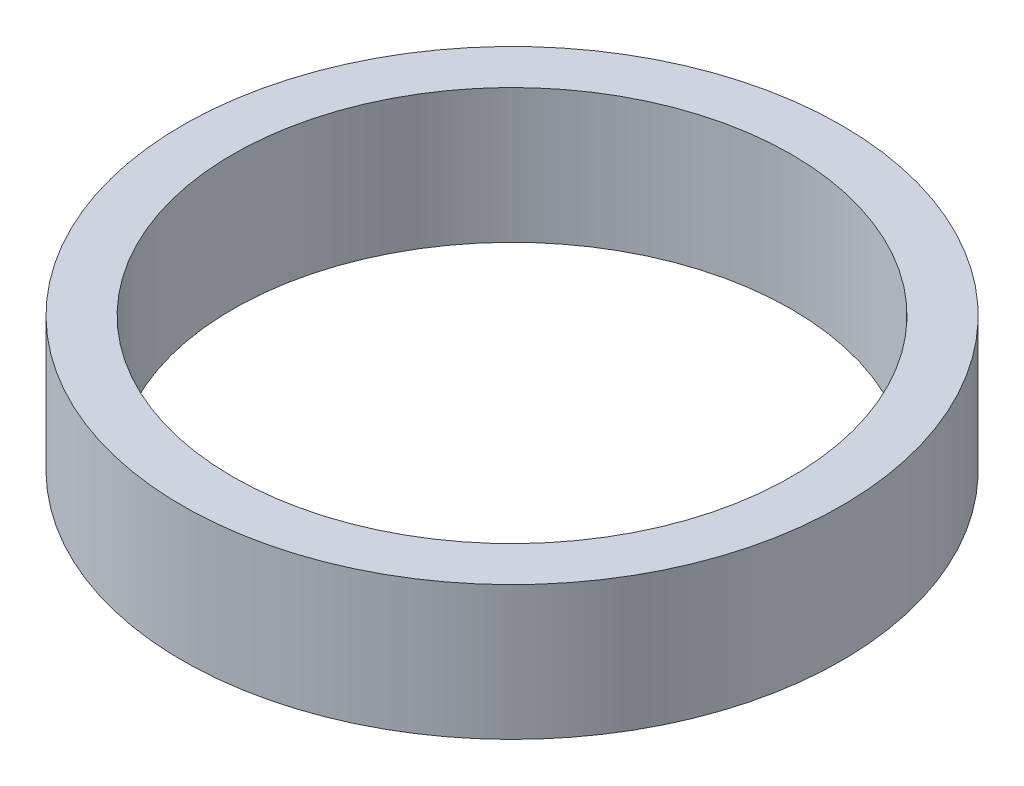
ISO-10303-21;
HEADER;
FILE_DESCRIPTION(('STEP AP214'),'2;1');
FILE_NAME('part.step','',(''),(''),'','','');
FILE_SCHEMA(('AUTOMOTIVE_DESIGN { 1 0 10303 214 1 1 1 1 }'));
ENDSEC;
DATA;
#1=APPLICATION_CONTEXT('core data for automotive mechanical design processes');
#2=APPLICATION_PROTOCOL_DEFINITION('international standard','automotive_design',2000,#1);
#3=PRODUCT_CONTEXT('',#1,'mechanical');
#4=PRODUCT('Part','Part','',(#3));
#5=PRODUCT_RELATED_PRODUCT_CATEGORY('part','',(#4));
#6=PRODUCT_DEFINITION_FORMATION('','',#4);
#7=PRODUCT_DEFINITION_CONTEXT('part definition',#1,'design');
#8=PRODUCT_DEFINITION('design','',#6,#7);
#9=PRODUCT_DEFINITION_SHAPE('','',#8);
#10=(LENGTH_UNIT() NAMED_UNIT(*) SI_UNIT(.MILLI.,.METRE.));
#11=(NAMED_UNIT(*) PLANE_ANGLE_UNIT() SI_UNIT($,.RADIAN.));
#12=(NAMED_UNIT(*) SI_UNIT($,.STERADIAN.) SOLID_ANGLE_UNIT());
#13=UNCERTAINTY_MEASURE_WITH_UNIT(LENGTH_MEASURE(1.E-05),#10,'distance_accuracy_value','');
#14=(GEOMETRIC_REPRESENTATION_CONTEXT(3) GLOBAL_UNCERTAINTY_ASSIGNED_CONTEXT((#13)) GLOBAL_UNIT_ASSIGNED_CONTEXT((#10,
#11,#12)) REPRESENTATION_CONTEXT('',''));
#15=CARTESIAN_POINT('',(0.,0.,0.));
#16=DIRECTION('',(0.,0.,1.));
#17=DIRECTION('',(1.,0.,0.));
#18=AXIS2_PLACEMENT_3D('',#15,#16,#17);
#19=CARTESIAN_POINT('',(0.,0.,0.));
#20=DIRECTION('',(0.,-1.,0.));
#21=DIRECTION('',(0.,0.,-1.));
#22=AXIS2_PLACEMENT_3D('',#19,#20,#21);
#23=CYLINDRICAL_SURFACE('',#22,29.5);
#24=CARTESIAN_POINT('',(0.,0.,0.));
#25=DIRECTION('',(0.,-1.,0.));
#26=DIRECTION('',(0.,0.,-1.));
#27=AXIS2_PLACEMENT_3D('',#24,#25,#26);
#28=CIRCLE('',#27,29.5);
#29=CARTESIAN_POINT('',(0.,0.,-29.5));
#30=VERTEX_POINT('',#29);
#31=EDGE_CURVE('E10',#30,#30,#28,.T.);
#32=ORIENTED_EDGE('',*,*,#31,.F.);
#33=EDGE_LOOP('',(#32));
#34=FACE_BOUND('',#33,.T.);
#35=CARTESIAN_POINT('',(0.,12.,0.));
#36=DIRECTION('',(0.,-1.,0.));
#37=DIRECTION('',(0.,0.,-1.));
#38=AXIS2_PLACEMENT_3D('',#35,#36,#37);
#39=CIRCLE('',#38,29.5);
#40=CARTESIAN_POINT('',(0.,12.,-29.5));
#41=VERTEX_POINT('',#40);
#42=EDGE_CURVE('E51',#41,#41,#39,.T.);
#43=ORIENTED_EDGE('',*,*,#42,.T.);
#44=EDGE_LOOP('',(#43));
#45=FACE_BOUND('',#44,.T.);
#46=ADVANCED_FACE('F37',(#34,#45),#23,.T.);
#47=CARTESIAN_POINT('',(-29.5,0.,0.));
#48=DIRECTION('',(0.,1.,0.));
#49=DIRECTION('',(0.,0.,1.));
#50=AXIS2_PLACEMENT_3D('',#47,#48,#49);
#51=PLANE('',#50);
#52=CARTESIAN_POINT('',(0.,0.,0.));
#53=DIRECTION('',(0.,-1.,0.));
#54=DIRECTION('',(0.,0.,-1.));
#55=AXIS2_PLACEMENT_3D('',#52,#53,#54);
#56=CIRCLE('',#55,25.);
#57=CARTESIAN_POINT('',(0.,0.,-25.));
#58=VERTEX_POINT('',#57);
#59=EDGE_CURVE('E43',#58,#58,#56,.T.);
#60=ORIENTED_EDGE('',*,*,#59,.F.);
#61=EDGE_LOOP('',(#60));
#62=FACE_BOUND('',#61,.T.);
#63=ORIENTED_EDGE('',*,*,#31,.T.);
#64=EDGE_LOOP('',(#63));
#65=FACE_BOUND('',#64,.T.);
#66=ADVANCED_FACE('F66',(#62,#65),#51,.F.);
#67=CARTESIAN_POINT('',(0.,0.,0.));
#68=DIRECTION('',(0.,-1.,0.));
#69=DIRECTION('',(0.,0.,-1.));
#70=AXIS2_PLACEMENT_3D('',#67,#68,#69);
#71=CYLINDRICAL_SURFACE('',#70,25.);
#72=CARTESIAN_POINT('',(0.,12.,0.));
#73=DIRECTION('',(0.,-1.,0.));
#74=DIRECTION('',(0.,0.,-1.));
#75=AXIS2_PLACEMENT_3D('',#72,#73,#74);
#76=CIRCLE('',#75,25.);
#77=CARTESIAN_POINT('',(0.,12.,-25.));
#78=VERTEX_POINT('',#77);
#79=EDGE_CURVE('E47',#78,#78,#76,.T.);
#80=ORIENTED_EDGE('',*,*,#79,.F.);
#81=EDGE_LOOP('',(#80));
#82=FACE_BOUND('',#81,.T.);
#83=ORIENTED_EDGE('',*,*,#59,.T.);
#84=EDGE_LOOP('',(#83));
#85=FACE_BOUND('',#84,.T.);
#86=ADVANCED_FACE('F61',(#82,#85),#71,.F.);
#87=CARTESIAN_POINT('',(-29.5,12.,0.));
#88=DIRECTION('',(0.,-1.,0.));
#89=DIRECTION('',(0.,0.,-1.));
#90=AXIS2_PLACEMENT_3D('',#87,#88,#89);
#91=PLANE('',#90);
#92=ORIENTED_EDGE('',*,*,#42,.F.);
#93=EDGE_LOOP('',(#92));
#94=FACE_BOUND('',#93,.T.);
#95=ORIENTED_EDGE('',*,*,#79,.T.);
#96=EDGE_LOOP('',(#95));
#97=FACE_BOUND('',#96,.T.);
#98=ADVANCED_FACE('F58',(#94,#97),#91,.F.);
#99=CLOSED_SHELL('',(#46,#66,#86,#98));
#100=MANIFOLD_SOLID_BREP('B2',#99);
#101=ADVANCED_BREP_SHAPE_REPRESENTATION('',(#18,#100),#14);
#102=SHAPE_DEFINITION_REPRESENTATION(#9,#101);
ENDSEC;
END-ISO-10303-21;
